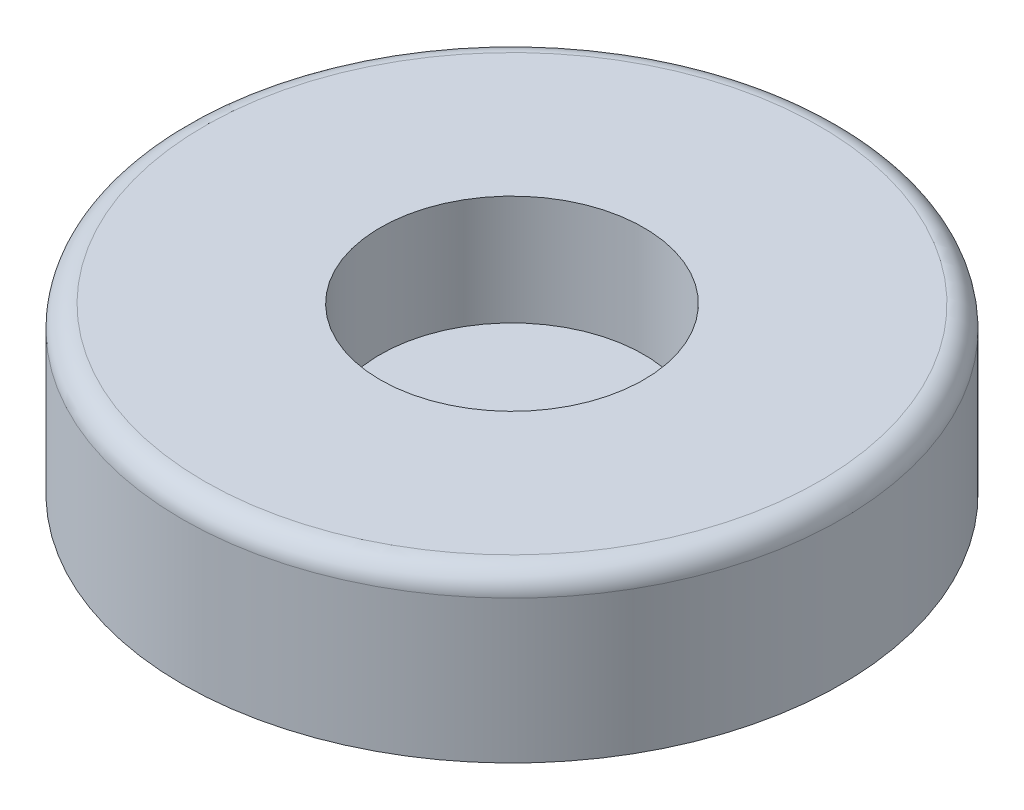
ISO-10303-21;
HEADER;
FILE_DESCRIPTION(('STEP AP214'),'2;1');
FILE_NAME('part.step','',(''),(''),'','','');
FILE_SCHEMA(('AUTOMOTIVE_DESIGN { 1 0 10303 214 1 1 1 1 }'));
ENDSEC;
DATA;
#1=APPLICATION_CONTEXT('core data for automotive mechanical design processes');
#2=APPLICATION_PROTOCOL_DEFINITION('international standard','automotive_design',2000,#1);
#3=PRODUCT_CONTEXT('',#1,'mechanical');
#4=PRODUCT('Part','Part','',(#3));
#5=PRODUCT_RELATED_PRODUCT_CATEGORY('part','',(#4));
#6=PRODUCT_DEFINITION_FORMATION('','',#4);
#7=PRODUCT_DEFINITION_CONTEXT('part definition',#1,'design');
#8=PRODUCT_DEFINITION('design','',#6,#7);
#9=PRODUCT_DEFINITION_SHAPE('','',#8);
#10=(LENGTH_UNIT() NAMED_UNIT(*) SI_UNIT(.MILLI.,.METRE.));
#11=(NAMED_UNIT(*) PLANE_ANGLE_UNIT() SI_UNIT($,.RADIAN.));
#12=(NAMED_UNIT(*) SI_UNIT($,.STERADIAN.) SOLID_ANGLE_UNIT());
#13=UNCERTAINTY_MEASURE_WITH_UNIT(LENGTH_MEASURE(1.E-05),#10,'distance_accuracy_value','');
#14=(GEOMETRIC_REPRESENTATION_CONTEXT(3) GLOBAL_UNCERTAINTY_ASSIGNED_CONTEXT((#13)) GLOBAL_UNIT_ASSIGNED_CONTEXT((#10,
#11,#12)) REPRESENTATION_CONTEXT('',''));
#15=CARTESIAN_POINT('',(0.,0.,0.));
#16=DIRECTION('',(0.,0.,1.));
#17=DIRECTION('',(1.,0.,0.));
#18=AXIS2_PLACEMENT_3D('',#15,#16,#17);
#19=CARTESIAN_POINT('',(0.,15.,0.));
#20=DIRECTION('',(0.,-1.,0.));
#21=DIRECTION('',(0.,0.,-1.));
#22=AXIS2_PLACEMENT_3D('',#19,#20,#21);
#23=CYLINDRICAL_SURFACE('',#22,30.);
#24=CARTESIAN_POINT('',(0.,13.,0.));
#25=DIRECTION('',(0.,1.,0.));
#26=DIRECTION('',(0.,0.,1.));
#27=AXIS2_PLACEMENT_3D('',#24,#25,#26);
#28=CIRCLE('',#27,30.);
#29=CARTESIAN_POINT('',(0.,13.,30.));
#30=VERTEX_POINT('',#29);
#31=EDGE_CURVE('E10',#30,#30,#28,.F.);
#32=ORIENTED_EDGE('',*,*,#31,.T.);
#33=EDGE_LOOP('',(#32));
#34=FACE_BOUND('',#33,.T.);
#35=CARTESIAN_POINT('',(0.,0.,0.));
#36=DIRECTION('',(0.,1.,0.));
#37=DIRECTION('',(0.,0.,1.));
#38=AXIS2_PLACEMENT_3D('',#35,#36,#37);
#39=CIRCLE('',#38,30.);
#40=CARTESIAN_POINT('',(0.,0.,30.));
#41=VERTEX_POINT('',#40);
#42=EDGE_CURVE('E42',#41,#41,#39,.T.);
#43=ORIENTED_EDGE('',*,*,#42,.T.);
#44=EDGE_LOOP('',(#43));
#45=FACE_BOUND('',#44,.T.);
#46=ADVANCED_FACE('F31',(#34,#45),#23,.T.);
#47=CARTESIAN_POINT('',(0.,15.,0.));
#48=DIRECTION('',(0.,1.,0.));
#49=DIRECTION('',(0.,0.,1.));
#50=AXIS2_PLACEMENT_3D('',#47,#48,#49);
#51=PLANE('',#50);
#52=CARTESIAN_POINT('',(0.,15.,0.));
#53=DIRECTION('',(0.,1.,0.));
#54=DIRECTION('',(0.,0.,1.));
#55=AXIS2_PLACEMENT_3D('',#52,#53,#54);
#56=CIRCLE('',#55,28.);
#57=CARTESIAN_POINT('',(0.,15.,28.));
#58=VERTEX_POINT('',#57);
#59=EDGE_CURVE('E38',#58,#58,#56,.T.);
#60=ORIENTED_EDGE('',*,*,#59,.T.);
#61=EDGE_LOOP('',(#60));
#62=FACE_BOUND('',#61,.T.);
#63=CARTESIAN_POINT('',(0.,15.,0.));
#64=DIRECTION('',(0.,1.,0.));
#65=DIRECTION('',(0.,0.,1.));
#66=AXIS2_PLACEMENT_3D('',#63,#64,#65);
#67=CIRCLE('',#66,12.);
#68=CARTESIAN_POINT('',(0.,15.,12.));
#69=VERTEX_POINT('',#68);
#70=EDGE_CURVE('E49',#69,#69,#67,.T.);
#71=ORIENTED_EDGE('',*,*,#70,.F.);
#72=EDGE_LOOP('',(#71));
#73=FACE_BOUND('',#72,.T.);
#74=ADVANCED_FACE('F64',(#62,#73),#51,.T.);
#75=CARTESIAN_POINT('',(0.,0.,0.));
#76=DIRECTION('',(0.,1.,0.));
#77=DIRECTION('',(0.,0.,1.));
#78=AXIS2_PLACEMENT_3D('',#75,#76,#77);
#79=PLANE('',#78);
#80=ORIENTED_EDGE('',*,*,#42,.F.);
#81=EDGE_LOOP('',(#80));
#82=FACE_BOUND('',#81,.T.);
#83=ADVANCED_FACE('F60',(#82),#79,.F.);
#84=CARTESIAN_POINT('',(0.,5.,0.));
#85=DIRECTION('',(0.,1.,0.));
#86=DIRECTION('',(0.,0.,1.));
#87=AXIS2_PLACEMENT_3D('',#84,#85,#86);
#88=CYLINDRICAL_SURFACE('',#87,12.);
#89=CARTESIAN_POINT('',(0.,5.,0.));
#90=DIRECTION('',(0.,1.,0.));
#91=DIRECTION('',(0.,0.,1.));
#92=AXIS2_PLACEMENT_3D('',#89,#90,#91);
#93=CIRCLE('',#92,12.);
#94=CARTESIAN_POINT('',(0.,5.,12.));
#95=VERTEX_POINT('',#94);
#96=EDGE_CURVE('E46',#95,#95,#93,.T.);
#97=ORIENTED_EDGE('',*,*,#96,.F.);
#98=EDGE_LOOP('',(#97));
#99=FACE_BOUND('',#98,.T.);
#100=ORIENTED_EDGE('',*,*,#70,.T.);
#101=EDGE_LOOP('',(#100));
#102=FACE_BOUND('',#101,.T.);
#103=ADVANCED_FACE('F57',(#99,#102),#88,.F.);
#104=CARTESIAN_POINT('',(0.,5.,0.));
#105=DIRECTION('',(0.,1.,0.));
#106=DIRECTION('',(0.,0.,1.));
#107=AXIS2_PLACEMENT_3D('',#104,#105,#106);
#108=PLANE('',#107);
#109=ORIENTED_EDGE('',*,*,#96,.T.);
#110=EDGE_LOOP('',(#109));
#111=FACE_BOUND('',#110,.T.);
#112=ADVANCED_FACE('F55',(#111),#108,.T.);
#113=CARTESIAN_POINT('',(0.,13.,0.));
#114=DIRECTION('',(0.,1.,0.));
#115=DIRECTION('',(0.,0.,1.));
#116=AXIS2_PLACEMENT_3D('',#113,#114,#115);
#117=TOROIDAL_SURFACE('',#116,28.,2.);
#118=ORIENTED_EDGE('',*,*,#31,.F.);
#119=EDGE_LOOP('',(#118));
#120=FACE_BOUND('',#119,.T.);
#121=ORIENTED_EDGE('',*,*,#59,.F.);
#122=EDGE_LOOP('',(#121));
#123=FACE_BOUND('',#122,.T.);
#124=ADVANCED_FACE('F33',(#120,#123),#117,.T.);
#125=CLOSED_SHELL('',(#46,#74,#83,#103,#112,#124));
#126=MANIFOLD_SOLID_BREP('B2',#125);
#127=ADVANCED_BREP_SHAPE_REPRESENTATION('',(#18,#126),#14);
#128=SHAPE_DEFINITION_REPRESENTATION(#9,#127);
ENDSEC;
END-ISO-10303-21;
